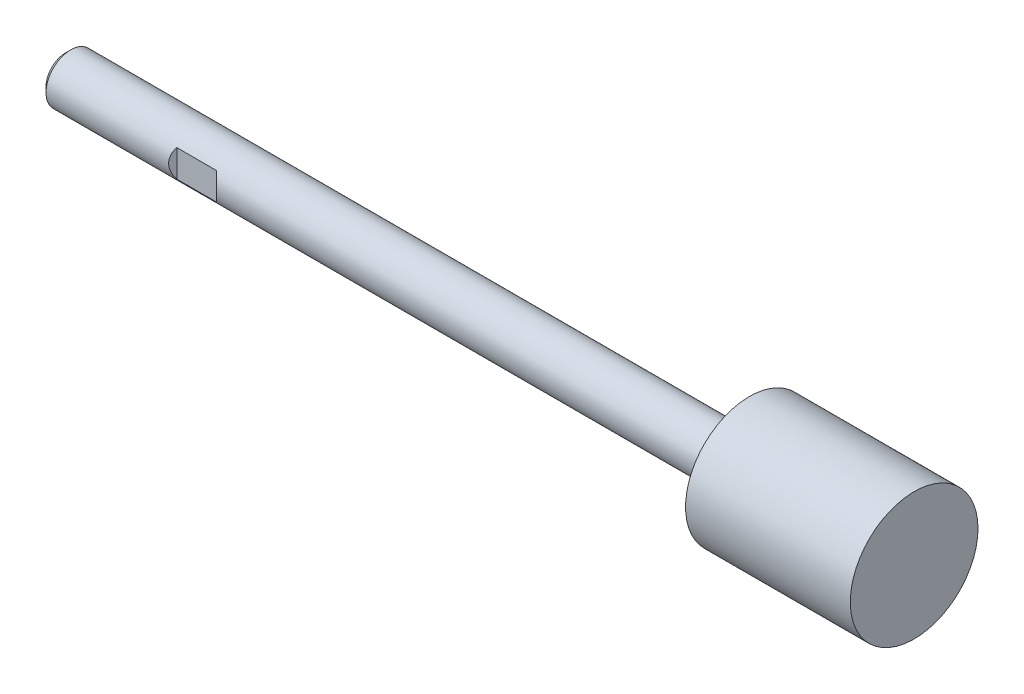
ISO-10303-21;
HEADER;
FILE_DESCRIPTION(('STEP AP214'),'2;1');
FILE_NAME('part.step','',(''),(''),'','','');
FILE_SCHEMA(('AUTOMOTIVE_DESIGN { 1 0 10303 214 1 1 1 1 }'));
ENDSEC;
DATA;
#1=APPLICATION_CONTEXT('core data for automotive mechanical design processes');
#2=APPLICATION_PROTOCOL_DEFINITION('international standard','automotive_design',2000,#1);
#3=PRODUCT_CONTEXT('',#1,'mechanical');
#4=PRODUCT('Part','Part','',(#3));
#5=PRODUCT_RELATED_PRODUCT_CATEGORY('part','',(#4));
#6=PRODUCT_DEFINITION_FORMATION('','',#4);
#7=PRODUCT_DEFINITION_CONTEXT('part definition',#1,'design');
#8=PRODUCT_DEFINITION('design','',#6,#7);
#9=PRODUCT_DEFINITION_SHAPE('','',#8);
#10=(LENGTH_UNIT() NAMED_UNIT(*) SI_UNIT(.MILLI.,.METRE.));
#11=(NAMED_UNIT(*) PLANE_ANGLE_UNIT() SI_UNIT($,.RADIAN.));
#12=(NAMED_UNIT(*) SI_UNIT($,.STERADIAN.) SOLID_ANGLE_UNIT());
#13=UNCERTAINTY_MEASURE_WITH_UNIT(LENGTH_MEASURE(1.E-05),#10,'distance_accuracy_value','');
#14=(GEOMETRIC_REPRESENTATION_CONTEXT(3) GLOBAL_UNCERTAINTY_ASSIGNED_CONTEXT((#13)) GLOBAL_UNIT_ASSIGNED_CONTEXT((#10,
#11,#12)) REPRESENTATION_CONTEXT('',''));
#15=CARTESIAN_POINT('',(0.,0.,0.));
#16=DIRECTION('',(0.,0.,1.));
#17=DIRECTION('',(1.,0.,0.));
#18=AXIS2_PLACEMENT_3D('',#15,#16,#17);
#19=CARTESIAN_POINT('',(103.,0.,0.));
#20=DIRECTION('',(1.,0.,0.));
#21=DIRECTION('',(0.,0.,-1.));
#22=AXIS2_PLACEMENT_3D('',#19,#20,#21);
#23=CYLINDRICAL_SURFACE('',#22,3.);
#24=CARTESIAN_POINT('',(16.0000000023952,-1.65831239878853,-2.49999999760485));
#25=CARTESIAN_POINT('',(15.8444361935459,-1.42379113365501,-2.65556380645408));
#26=CARTESIAN_POINT('',(15.7141450639294,-1.15266930135842,-2.78585493607065));
#27=CARTESIAN_POINT('',(15.5412922907834,-0.579381510358978,-2.95870770921655));
#28=CARTESIAN_POINT('',(15.5,-0.301232165318897,-3.));
#29=CARTESIAN_POINT('',(15.5,0.301232165317736,-3.));
#30=CARTESIAN_POINT('',(15.5412922907831,0.579381510356781,-2.95870770921686));
#31=CARTESIAN_POINT('',(15.7141450639277,1.15266930135414,-2.78585493607229));
#32=CARTESIAN_POINT('',(15.8444361935433,1.42379113364987,-2.65556380645673));
#33=CARTESIAN_POINT('',(16.0000000023914,1.65831239878289,-2.49999999760859));
#34=B_SPLINE_CURVE_WITH_KNOTS('',3,(#24,#25,#26,#27,#28,#29,#30,#31,#32,#33),.UNSPECIFIED.,.F.,
.F.,(4,2,2,2,4),(2.55590710868831,2.84874988113905,3.14159265358979,3.43443542603941,
3.72727819848902),.UNSPECIFIED.);
#35=CARTESIAN_POINT('',(16.,-1.6583123951777,-2.5));
#36=VERTEX_POINT('',#35);
#37=CARTESIAN_POINT('',(16.,1.6583123951777,-2.5));
#38=VERTEX_POINT('',#37);
#39=EDGE_CURVE('E62',#36,#38,#34,.T.);
#40=ORIENTED_EDGE('',*,*,#39,.F.);
#41=DIRECTION('',(-1.,0.,0.));
#42=VECTOR('',#41,1.);
#43=CARTESIAN_POINT('',(20.8,-1.6583123951777,-2.5));
#44=LINE('',#43,#42);
#45=CARTESIAN_POINT('',(20.8,-1.6583123951777,-2.5));
#46=VERTEX_POINT('',#45);
#47=EDGE_CURVE('E72',#46,#36,#44,.T.);
#48=ORIENTED_EDGE('',*,*,#47,.F.);
#49=CARTESIAN_POINT('',(20.7999999976094,1.65831239878171,-2.49999999760937));
#50=CARTESIAN_POINT('',(20.9555638064573,1.4237911336488,-2.65556380645728));
#51=CARTESIAN_POINT('',(21.0858549360726,1.15266930135324,-2.78585493607264));
#52=CARTESIAN_POINT('',(21.2587077092169,0.579381510356322,-2.95870770921693));
#53=CARTESIAN_POINT('',(21.3,0.301232165317451,-3.));
#54=CARTESIAN_POINT('',(21.3,-0.301232165317565,-3.));
#55=CARTESIAN_POINT('',(21.2587077092169,-0.579381510356538,-2.9587077092169));
#56=CARTESIAN_POINT('',(21.0858549360725,-1.15266930135367,-2.78585493607247));
#57=CARTESIAN_POINT('',(20.955563806457,-1.42379113364931,-2.65556380645702));
#58=CARTESIAN_POINT('',(20.799999997609,-1.65831239878226,-2.499999997609));
#59=B_SPLINE_CURVE_WITH_KNOTS('',3,(#49,#50,#51,#52,#53,#54,#55,#56,#57,#58),.UNSPECIFIED.,.F.,
.F.,(4,2,2,2,4),(5.69749976228083,5.99034253473021,6.28318530717959,6.57602807962907,
6.86887085207856),.UNSPECIFIED.);
#60=CARTESIAN_POINT('',(20.8,1.6583123951777,-2.5));
#61=VERTEX_POINT('',#60);
#62=EDGE_CURVE('E78',#61,#46,#59,.T.);
#63=ORIENTED_EDGE('',*,*,#62,.F.);
#64=DIRECTION('',(1.,0.,0.));
#65=VECTOR('',#64,1.);
#66=CARTESIAN_POINT('',(16.,1.6583123951777,-2.5));
#67=LINE('',#66,#65);
#68=EDGE_CURVE('E77',#38,#61,#67,.T.);
#69=ORIENTED_EDGE('',*,*,#68,.F.);
#70=EDGE_LOOP('',(#40,#48,#63,#69));
#71=FACE_BOUND('',#70,.T.);
#72=CARTESIAN_POINT('',(83.,0.,0.));
#73=DIRECTION('',(1.,0.,0.));
#74=DIRECTION('',(0.,0.,-1.));
#75=AXIS2_PLACEMENT_3D('',#72,#73,#74);
#76=CIRCLE('',#75,3.);
#77=CARTESIAN_POINT('',(83.,0.,-3.));
#78=VERTEX_POINT('',#77);
#79=EDGE_CURVE('E200',#78,#78,#76,.T.);
#80=ORIENTED_EDGE('',*,*,#79,.F.);
#81=EDGE_LOOP('',(#80));
#82=FACE_BOUND('',#81,.T.);
#83=CARTESIAN_POINT('',(0.613500000000002,0.,0.));
#84=DIRECTION('',(1.,0.,0.));
#85=DIRECTION('',(0.,0.,-1.));
#86=AXIS2_PLACEMENT_3D('',#83,#84,#85);
#87=CIRCLE('',#86,3.);
#88=CARTESIAN_POINT('',(0.613500000000002,0.,-3.));
#89=VERTEX_POINT('',#88);
#90=EDGE_CURVE('E194',#89,#89,#87,.T.);
#91=ORIENTED_EDGE('',*,*,#90,.T.);
#92=EDGE_LOOP('',(#91));
#93=FACE_BOUND('',#92,.T.);
#94=CARTESIAN_POINT('',(20.7999999976094,-1.65831239878171,2.49999999760937));
#95=CARTESIAN_POINT('',(20.9555638064573,-1.4237911336488,2.65556380645728));
#96=CARTESIAN_POINT('',(21.0858549360726,-1.15266930135325,2.78585493607264));
#97=CARTESIAN_POINT('',(21.2587077092169,-0.579381510356323,2.95870770921693));
#98=CARTESIAN_POINT('',(21.3,-0.301232165317417,3.));
#99=CARTESIAN_POINT('',(21.3,0.301232165316255,3.));
#100=CARTESIAN_POINT('',(21.2587077092172,0.579381510354126,2.95870770921724));
#101=CARTESIAN_POINT('',(21.0858549360743,1.15266930134896,2.78585493607428));
#102=CARTESIAN_POINT('',(20.9555638064599,1.42379113364367,2.65556380645992));
#103=CARTESIAN_POINT('',(20.7999999976131,1.65831239877607,2.49999999761311));
#104=B_SPLINE_CURVE_WITH_KNOTS('',3,(#94,#95,#96,#97,#98,#99,#100,#101,#102,#103),.UNSPECIFIED.,
.F.,.F.,(4,2,2,2,4),(5.69749976228083,5.99034253473021,6.28318530717959,6.57602807962784,
6.86887085207609),.UNSPECIFIED.);
#105=CARTESIAN_POINT('',(20.8,-1.6583123951777,2.5));
#106=VERTEX_POINT('',#105);
#107=CARTESIAN_POINT('',(20.8,1.6583123951777,2.5));
#108=VERTEX_POINT('',#107);
#109=EDGE_CURVE('E126',#106,#108,#104,.T.);
#110=ORIENTED_EDGE('',*,*,#109,.F.);
#111=DIRECTION('',(1.,0.,0.));
#112=VECTOR('',#111,1.);
#113=CARTESIAN_POINT('',(16.,-1.6583123951777,2.5));
#114=LINE('',#113,#112);
#115=CARTESIAN_POINT('',(16.,-1.6583123951777,2.5));
#116=VERTEX_POINT('',#115);
#117=EDGE_CURVE('E119',#116,#106,#114,.T.);
#118=ORIENTED_EDGE('',*,*,#117,.F.);
#119=CARTESIAN_POINT('',(16.000000002391,1.65831239878233,2.49999999760896));
#120=CARTESIAN_POINT('',(15.844436193543,1.42379113364937,2.65556380645699));
#121=CARTESIAN_POINT('',(15.7141450639275,1.15266930135372,2.78585493607246));
#122=CARTESIAN_POINT('',(15.5412922907831,0.579381510356564,2.95870770921689));
#123=CARTESIAN_POINT('',(15.5,0.301232165317626,3.));
#124=CARTESIAN_POINT('',(15.5,-0.301232165319143,3.));
#125=CARTESIAN_POINT('',(15.5412922907835,-0.579381510359437,2.95870770921649));
#126=CARTESIAN_POINT('',(15.7141450639297,-1.15266930135932,2.78585493607031));
#127=CARTESIAN_POINT('',(15.8444361935465,-1.42379113365608,2.65556380645353));
#128=CARTESIAN_POINT('',(16.0000000023959,-1.65831239878971,2.49999999760407));
#129=B_SPLINE_CURVE_WITH_KNOTS('',3,(#119,#120,#121,#122,#123,#124,#125,#126,#127,#128),
.UNSPECIFIED.,.F.,.F.,(4,2,2,2,4),(2.55590710869079,2.84874988114029,3.14159265358979,
3.43443542604077,3.72727819849175),.UNSPECIFIED.);
#130=CARTESIAN_POINT('',(16.,1.6583123951777,2.5));
#131=VERTEX_POINT('',#130);
#132=EDGE_CURVE('E125',#131,#116,#129,.T.);
#133=ORIENTED_EDGE('',*,*,#132,.F.);
#134=DIRECTION('',(-1.,0.,0.));
#135=VECTOR('',#134,1.);
#136=CARTESIAN_POINT('',(20.8,1.6583123951777,2.5));
#137=LINE('',#136,#135);
#138=EDGE_CURVE('E129',#108,#131,#137,.T.);
#139=ORIENTED_EDGE('',*,*,#138,.F.);
#140=EDGE_LOOP('',(#110,#118,#133,#139));
#141=FACE_BOUND('',#140,.T.);
#142=ADVANCED_FACE('F17',(#71,#82,#93,#141),#23,.T.);
#143=CARTESIAN_POINT('',(0.,0.,0.));
#144=DIRECTION('',(1.,0.,0.));
#145=DIRECTION('',(0.,0.,-1.));
#146=AXIS2_PLACEMENT_3D('',#143,#144,#145);
#147=PLANE('',#146);
#148=CARTESIAN_POINT('',(0.,0.,0.));
#149=DIRECTION('',(1.,0.,0.));
#150=DIRECTION('',(0.,0.,-1.));
#151=AXIS2_PLACEMENT_3D('',#148,#149,#150);
#152=CIRCLE('',#151,2.3865);
#153=CARTESIAN_POINT('',(0.,0.,-2.3865));
#154=VERTEX_POINT('',#153);
#155=EDGE_CURVE('E133',#154,#154,#152,.T.);
#156=ORIENTED_EDGE('',*,*,#155,.F.);
#157=EDGE_LOOP('',(#156));
#158=FACE_BOUND('',#157,.T.);
#159=ADVANCED_FACE('F101',(#158),#147,.F.);
#160=CARTESIAN_POINT('',(0.,0.,0.));
#161=DIRECTION('',(1.,0.,0.));
#162=DIRECTION('',(0.,0.,-1.));
#163=AXIS2_PLACEMENT_3D('',#160,#161,#162);
#164=CONICAL_SURFACE('',#163,2.3865,0.785398163397446);
#165=ORIENTED_EDGE('',*,*,#90,.F.);
#166=EDGE_LOOP('',(#165));
#167=FACE_BOUND('',#166,.T.);
#168=ORIENTED_EDGE('',*,*,#155,.T.);
#169=EDGE_LOOP('',(#168));
#170=FACE_BOUND('',#169,.T.);
#171=ADVANCED_FACE('F210',(#167,#170),#164,.T.);
#172=CARTESIAN_POINT('',(83.,3.,0.));
#173=DIRECTION('',(1.,0.,0.));
#174=DIRECTION('',(0.,0.,-1.));
#175=AXIS2_PLACEMENT_3D('',#172,#173,#174);
#176=PLANE('',#175);
#177=CARTESIAN_POINT('',(83.,0.,0.));
#178=DIRECTION('',(1.,0.,0.));
#179=DIRECTION('',(0.,0.,-1.));
#180=AXIS2_PLACEMENT_3D('',#177,#178,#179);
#181=CIRCLE('',#180,7.75);
#182=CARTESIAN_POINT('',(83.,0.,-7.75));
#183=VERTEX_POINT('',#182);
#184=EDGE_CURVE('E134',#183,#183,#181,.T.);
#185=ORIENTED_EDGE('',*,*,#184,.F.);
#186=EDGE_LOOP('',(#185));
#187=FACE_BOUND('',#186,.T.);
#188=ORIENTED_EDGE('',*,*,#79,.T.);
#189=EDGE_LOOP('',(#188));
#190=FACE_BOUND('',#189,.T.);
#191=ADVANCED_FACE('F204',(#187,#190),#176,.F.);
#192=CARTESIAN_POINT('',(103.,0.,0.));
#193=DIRECTION('',(1.,0.,0.));
#194=DIRECTION('',(0.,0.,-1.));
#195=AXIS2_PLACEMENT_3D('',#192,#193,#194);
#196=CYLINDRICAL_SURFACE('',#195,7.75);
#197=CARTESIAN_POINT('',(103.,0.,0.));
#198=DIRECTION('',(1.,0.,0.));
#199=DIRECTION('',(0.,0.,-1.));
#200=AXIS2_PLACEMENT_3D('',#197,#198,#199);
#201=CIRCLE('',#200,7.75);
#202=CARTESIAN_POINT('',(103.,0.,-7.75));
#203=VERTEX_POINT('',#202);
#204=EDGE_CURVE('E145',#203,#203,#201,.T.);
#205=ORIENTED_EDGE('',*,*,#204,.F.);
#206=EDGE_LOOP('',(#205));
#207=FACE_BOUND('',#206,.T.);
#208=ORIENTED_EDGE('',*,*,#184,.T.);
#209=EDGE_LOOP('',(#208));
#210=FACE_BOUND('',#209,.T.);
#211=ADVANCED_FACE('F209',(#207,#210),#196,.T.);
#212=CARTESIAN_POINT('',(103.,7.75,0.));
#213=DIRECTION('',(-1.,0.,0.));
#214=DIRECTION('',(0.,0.,1.));
#215=AXIS2_PLACEMENT_3D('',#212,#213,#214);
#216=PLANE('',#215);
#217=ORIENTED_EDGE('',*,*,#204,.T.);
#218=EDGE_LOOP('',(#217));
#219=FACE_BOUND('',#218,.T.);
#220=ADVANCED_FACE('F165',(#219),#216,.F.);
#221=CARTESIAN_POINT('',(20.8,2.5,-2.5));
#222=DIRECTION('',(-0.707106781186548,0.,-0.707106781186548));
#223=DIRECTION('',(-0.707106781186548,0.,0.707106781186548));
#224=AXIS2_PLACEMENT_3D('',#221,#222,#223);
#225=PLANE('',#224);
#226=ORIENTED_EDGE('',*,*,#62,.T.);
#227=DIRECTION('',(0.,-1.,0.));
#228=VECTOR('',#227,1.);
#229=CARTESIAN_POINT('',(20.8,1.6583123951777,-2.5));
#230=LINE('',#229,#228);
#231=EDGE_CURVE('E70',#61,#46,#230,.T.);
#232=ORIENTED_EDGE('',*,*,#231,.F.);
#233=EDGE_LOOP('',(#226,#232));
#234=FACE_BOUND('',#233,.T.);
#235=ADVANCED_FACE('F152',(#234),#225,.T.);
#236=CARTESIAN_POINT('',(16.,2.5,-2.5));
#237=DIRECTION('',(0.,0.,-1.));
#238=DIRECTION('',(-1.,0.,0.));
#239=AXIS2_PLACEMENT_3D('',#236,#237,#238);
#240=PLANE('',#239);
#241=ORIENTED_EDGE('',*,*,#68,.T.);
#242=ORIENTED_EDGE('',*,*,#231,.T.);
#243=ORIENTED_EDGE('',*,*,#47,.T.);
#244=DIRECTION('',(0.,-1.,0.));
#245=VECTOR('',#244,1.);
#246=CARTESIAN_POINT('',(16.,1.6583123951777,-2.5));
#247=LINE('',#246,#245);
#248=EDGE_CURVE('E56',#38,#36,#247,.T.);
#249=ORIENTED_EDGE('',*,*,#248,.F.);
#250=EDGE_LOOP('',(#241,#242,#243,#249));
#251=FACE_BOUND('',#250,.T.);
#252=ADVANCED_FACE('F79',(#251),#240,.T.);
#253=CARTESIAN_POINT('',(14.4,2.5,-4.1));
#254=DIRECTION('',(0.707106781186548,0.,-0.707106781186548));
#255=DIRECTION('',(-0.707106781186548,0.,-0.707106781186548));
#256=AXIS2_PLACEMENT_3D('',#253,#254,#255);
#257=PLANE('',#256);
#258=ORIENTED_EDGE('',*,*,#39,.T.);
#259=ORIENTED_EDGE('',*,*,#248,.T.);
#260=EDGE_LOOP('',(#258,#259));
#261=FACE_BOUND('',#260,.T.);
#262=ADVANCED_FACE('F61',(#261),#257,.T.);
#263=CARTESIAN_POINT('',(30.3,2.5,12.));
#264=DIRECTION('',(-0.707106781186548,0.,0.707106781186548));
#265=DIRECTION('',(0.707106781186548,0.,0.707106781186548));
#266=AXIS2_PLACEMENT_3D('',#263,#264,#265);
#267=PLANE('',#266);
#268=ORIENTED_EDGE('',*,*,#109,.T.);
#269=DIRECTION('',(0.,-1.,0.));
#270=VECTOR('',#269,1.);
#271=CARTESIAN_POINT('',(20.8,1.6583123951777,2.5));
#272=LINE('',#271,#270);
#273=EDGE_CURVE('E29',#108,#106,#272,.T.);
#274=ORIENTED_EDGE('',*,*,#273,.T.);
#275=EDGE_LOOP('',(#268,#274));
#276=FACE_BOUND('',#275,.T.);
#277=ADVANCED_FACE('F167',(#276),#267,.T.);
#278=CARTESIAN_POINT('',(20.8,2.5,2.5));
#279=DIRECTION('',(0.,0.,1.));
#280=DIRECTION('',(1.,0.,0.));
#281=AXIS2_PLACEMENT_3D('',#278,#279,#280);
#282=PLANE('',#281);
#283=ORIENTED_EDGE('',*,*,#117,.T.);
#284=ORIENTED_EDGE('',*,*,#273,.F.);
#285=ORIENTED_EDGE('',*,*,#138,.T.);
#286=DIRECTION('',(0.,-1.,0.));
#287=VECTOR('',#286,1.);
#288=CARTESIAN_POINT('',(16.,1.6583123951777,2.5));
#289=LINE('',#288,#287);
#290=EDGE_CURVE('E11',#131,#116,#289,.T.);
#291=ORIENTED_EDGE('',*,*,#290,.T.);
#292=EDGE_LOOP('',(#283,#284,#285,#291));
#293=FACE_BOUND('',#292,.T.);
#294=ADVANCED_FACE('F131',(#293),#282,.T.);
#295=CARTESIAN_POINT('',(16.,2.5,2.5));
#296=DIRECTION('',(0.707106781186548,0.,0.707106781186548));
#297=DIRECTION('',(0.707106781186548,0.,-0.707106781186548));
#298=AXIS2_PLACEMENT_3D('',#295,#296,#297);
#299=PLANE('',#298);
#300=ORIENTED_EDGE('',*,*,#132,.T.);
#301=ORIENTED_EDGE('',*,*,#290,.F.);
#302=EDGE_LOOP('',(#300,#301));
#303=FACE_BOUND('',#302,.T.);
#304=ADVANCED_FACE('F19',(#303),#299,.T.);
#305=CLOSED_SHELL('',(#142,#159,#171,#191,#211,#220,#235,#252,#262,#277,#294,#304));
#306=MANIFOLD_SOLID_BREP('B1',#305);
#307=ADVANCED_BREP_SHAPE_REPRESENTATION('',(#18,#306),#14);
#308=SHAPE_DEFINITION_REPRESENTATION(#9,#307);
ENDSEC;
END-ISO-10303-21;
